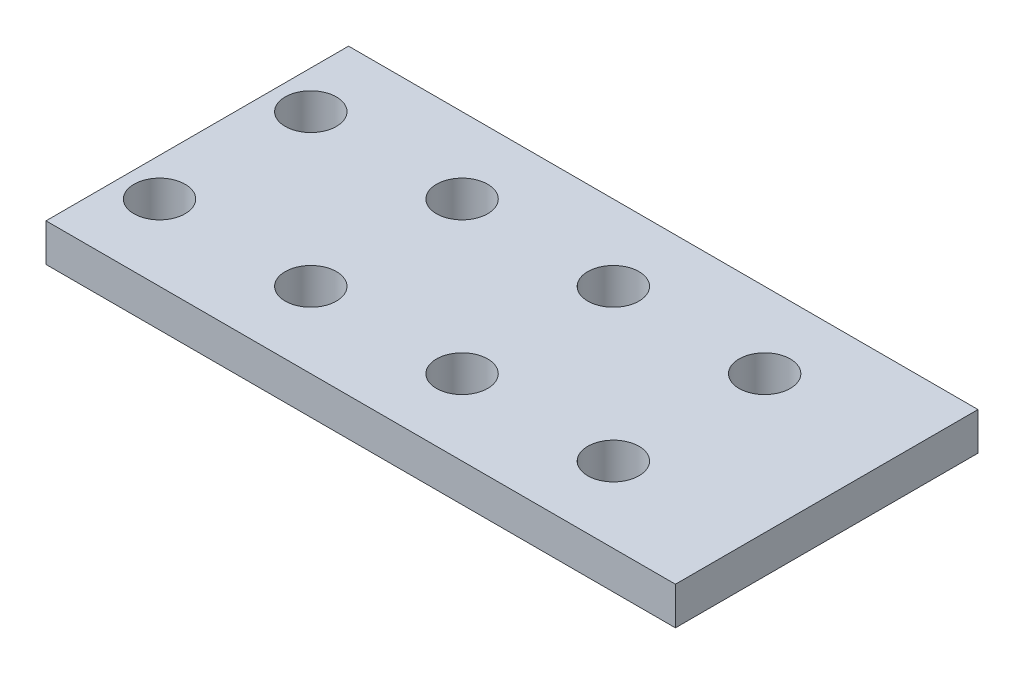
ISO-10303-21;
HEADER;
FILE_DESCRIPTION(('STEP AP214'),'2;1');
FILE_NAME('part.step','',(''),(''),'','','');
FILE_SCHEMA(('AUTOMOTIVE_DESIGN { 1 0 10303 214 1 1 1 1 }'));
ENDSEC;
DATA;
#1=APPLICATION_CONTEXT('core data for automotive mechanical design processes');
#2=APPLICATION_PROTOCOL_DEFINITION('international standard','automotive_design',2000,#1);
#3=PRODUCT_CONTEXT('',#1,'mechanical');
#4=PRODUCT('Part','Part','',(#3));
#5=PRODUCT_RELATED_PRODUCT_CATEGORY('part','',(#4));
#6=PRODUCT_DEFINITION_FORMATION('','',#4);
#7=PRODUCT_DEFINITION_CONTEXT('part definition',#1,'design');
#8=PRODUCT_DEFINITION('design','',#6,#7);
#9=PRODUCT_DEFINITION_SHAPE('','',#8);
#10=(LENGTH_UNIT() NAMED_UNIT(*) SI_UNIT(.MILLI.,.METRE.));
#11=(NAMED_UNIT(*) PLANE_ANGLE_UNIT() SI_UNIT($,.RADIAN.));
#12=(NAMED_UNIT(*) SI_UNIT($,.STERADIAN.) SOLID_ANGLE_UNIT());
#13=UNCERTAINTY_MEASURE_WITH_UNIT(LENGTH_MEASURE(1.E-05),#10,'distance_accuracy_value','');
#14=(GEOMETRIC_REPRESENTATION_CONTEXT(3) GLOBAL_UNCERTAINTY_ASSIGNED_CONTEXT((#13)) GLOBAL_UNIT_ASSIGNED_CONTEXT((#10,
#11,#12)) REPRESENTATION_CONTEXT('',''));
#15=CARTESIAN_POINT('',(0.,0.,0.));
#16=DIRECTION('',(0.,0.,1.));
#17=DIRECTION('',(1.,0.,0.));
#18=AXIS2_PLACEMENT_3D('',#15,#16,#17);
#19=CARTESIAN_POINT('',(20.,3.175,0.));
#20=DIRECTION('',(1.,0.,0.));
#21=DIRECTION('',(0.,0.,-1.));
#22=AXIS2_PLACEMENT_3D('',#19,#20,#21);
#23=PLANE('',#22);
#24=DIRECTION('',(0.,0.,1.));
#25=VECTOR('',#24,1.);
#26=CARTESIAN_POINT('',(20.,0.,0.));
#27=LINE('',#26,#25);
#28=CARTESIAN_POINT('',(20.,0.,-12.7));
#29=VERTEX_POINT('',#28);
#30=CARTESIAN_POINT('',(20.,0.,12.7));
#31=VERTEX_POINT('',#30);
#32=EDGE_CURVE('E146',#29,#31,#27,.T.);
#33=ORIENTED_EDGE('',*,*,#32,.T.);
#34=DIRECTION('',(0.,-1.,0.));
#35=VECTOR('',#34,1.);
#36=CARTESIAN_POINT('',(20.,3.175,12.7));
#37=LINE('',#36,#35);
#38=CARTESIAN_POINT('',(20.,3.175,12.7));
#39=VERTEX_POINT('',#38);
#40=EDGE_CURVE('E11',#39,#31,#37,.T.);
#41=ORIENTED_EDGE('',*,*,#40,.F.);
#42=DIRECTION('',(0.,0.,1.));
#43=VECTOR('',#42,1.);
#44=CARTESIAN_POINT('',(20.,3.175,0.));
#45=LINE('',#44,#43);
#46=CARTESIAN_POINT('',(20.,3.175,-12.7));
#47=VERTEX_POINT('',#46);
#48=EDGE_CURVE('E96',#47,#39,#45,.T.);
#49=ORIENTED_EDGE('',*,*,#48,.F.);
#50=DIRECTION('',(0.,-1.,0.));
#51=VECTOR('',#50,1.);
#52=CARTESIAN_POINT('',(20.,3.175,-12.7));
#53=LINE('',#52,#51);
#54=EDGE_CURVE('E63',#47,#29,#53,.T.);
#55=ORIENTED_EDGE('',*,*,#54,.T.);
#56=EDGE_LOOP('',(#33,#41,#49,#55));
#57=FACE_BOUND('',#56,.T.);
#58=ADVANCED_FACE('F45',(#57),#23,.F.);
#59=CARTESIAN_POINT('',(0.,3.175,12.7));
#60=DIRECTION('',(0.,0.,-1.));
#61=DIRECTION('',(-1.,0.,0.));
#62=AXIS2_PLACEMENT_3D('',#59,#60,#61);
#63=PLANE('',#62);
#64=DIRECTION('',(1.,0.,0.));
#65=VECTOR('',#64,1.);
#66=CARTESIAN_POINT('',(0.,0.,12.7));
#67=LINE('',#66,#65);
#68=CARTESIAN_POINT('',(72.84,0.,12.7));
#69=VERTEX_POINT('',#68);
#70=EDGE_CURVE('E102',#31,#69,#67,.T.);
#71=ORIENTED_EDGE('',*,*,#70,.T.);
#72=DIRECTION('',(0.,-1.,0.));
#73=VECTOR('',#72,1.);
#74=CARTESIAN_POINT('',(72.84,3.175,12.7));
#75=LINE('',#74,#73);
#76=CARTESIAN_POINT('',(72.84,3.175,12.7));
#77=VERTEX_POINT('',#76);
#78=EDGE_CURVE('E55',#77,#69,#75,.T.);
#79=ORIENTED_EDGE('',*,*,#78,.F.);
#80=DIRECTION('',(1.,0.,0.));
#81=VECTOR('',#80,1.);
#82=CARTESIAN_POINT('',(0.,3.175,12.7));
#83=LINE('',#82,#81);
#84=EDGE_CURVE('E88',#39,#77,#83,.T.);
#85=ORIENTED_EDGE('',*,*,#84,.F.);
#86=ORIENTED_EDGE('',*,*,#40,.T.);
#87=EDGE_LOOP('',(#71,#79,#85,#86));
#88=FACE_BOUND('',#87,.T.);
#89=ADVANCED_FACE('F101',(#88),#63,.F.);
#90=CARTESIAN_POINT('',(72.84,3.175,0.));
#91=DIRECTION('',(1.,0.,0.));
#92=DIRECTION('',(0.,0.,-1.));
#93=AXIS2_PLACEMENT_3D('',#90,#91,#92);
#94=PLANE('',#93);
#95=DIRECTION('',(0.,0.,1.));
#96=VECTOR('',#95,1.);
#97=CARTESIAN_POINT('',(72.84,0.,0.));
#98=LINE('',#97,#96);
#99=CARTESIAN_POINT('',(72.84,0.,-12.7));
#100=VERTEX_POINT('',#99);
#101=EDGE_CURVE('E151',#100,#69,#98,.T.);
#102=ORIENTED_EDGE('',*,*,#101,.F.);
#103=DIRECTION('',(0.,-1.,0.));
#104=VECTOR('',#103,1.);
#105=CARTESIAN_POINT('',(72.84,3.175,-12.7));
#106=LINE('',#105,#104);
#107=CARTESIAN_POINT('',(72.84,3.175,-12.7));
#108=VERTEX_POINT('',#107);
#109=EDGE_CURVE('E77',#108,#100,#106,.T.);
#110=ORIENTED_EDGE('',*,*,#109,.F.);
#111=DIRECTION('',(0.,0.,1.));
#112=VECTOR('',#111,1.);
#113=CARTESIAN_POINT('',(72.84,3.175,0.));
#114=LINE('',#113,#112);
#115=EDGE_CURVE('E95',#108,#77,#114,.T.);
#116=ORIENTED_EDGE('',*,*,#115,.T.);
#117=ORIENTED_EDGE('',*,*,#78,.T.);
#118=EDGE_LOOP('',(#102,#110,#116,#117));
#119=FACE_BOUND('',#118,.T.);
#120=ADVANCED_FACE('F106',(#119),#94,.T.);
#121=CARTESIAN_POINT('',(23.18,3.175,-6.35));
#122=DIRECTION('',(0.,-1.,0.));
#123=DIRECTION('',(0.,0.,-1.));
#124=AXIS2_PLACEMENT_3D('',#121,#122,#123);
#125=CYLINDRICAL_SURFACE('',#124,2.15);
#126=CARTESIAN_POINT('',(23.18,3.175,-6.35));
#127=DIRECTION('',(0.,1.,0.));
#128=DIRECTION('',(0.,0.,1.));
#129=AXIS2_PLACEMENT_3D('',#126,#127,#128);
#130=CIRCLE('',#129,2.15);
#131=CARTESIAN_POINT('',(23.18,3.175,-4.2));
#132=VERTEX_POINT('',#131);
#133=EDGE_CURVE('E193',#132,#132,#130,.T.);
#134=ORIENTED_EDGE('',*,*,#133,.T.);
#135=EDGE_LOOP('',(#134));
#136=FACE_BOUND('',#135,.T.);
#137=CARTESIAN_POINT('',(23.18,0.,-6.35));
#138=DIRECTION('',(0.,1.,0.));
#139=DIRECTION('',(0.,0.,1.));
#140=AXIS2_PLACEMENT_3D('',#137,#138,#139);
#141=CIRCLE('',#140,2.15);
#142=CARTESIAN_POINT('',(23.18,0.,-4.2));
#143=VERTEX_POINT('',#142);
#144=EDGE_CURVE('E142',#143,#143,#141,.T.);
#145=ORIENTED_EDGE('',*,*,#144,.F.);
#146=EDGE_LOOP('',(#145));
#147=FACE_BOUND('',#146,.T.);
#148=ADVANCED_FACE('F199',(#136,#147),#125,.F.);
#149=CARTESIAN_POINT('',(35.88,3.175,-6.35));
#150=DIRECTION('',(0.,-1.,0.));
#151=DIRECTION('',(0.,0.,-1.));
#152=AXIS2_PLACEMENT_3D('',#149,#150,#151);
#153=CYLINDRICAL_SURFACE('',#152,2.15);
#154=CARTESIAN_POINT('',(35.88,3.175,-6.35));
#155=DIRECTION('',(0.,1.,0.));
#156=DIRECTION('',(0.,0.,1.));
#157=AXIS2_PLACEMENT_3D('',#154,#155,#156);
#158=CIRCLE('',#157,2.15);
#159=CARTESIAN_POINT('',(35.88,3.175,-4.2));
#160=VERTEX_POINT('',#159);
#161=EDGE_CURVE('E189',#160,#160,#158,.T.);
#162=ORIENTED_EDGE('',*,*,#161,.T.);
#163=EDGE_LOOP('',(#162));
#164=FACE_BOUND('',#163,.T.);
#165=CARTESIAN_POINT('',(35.88,0.,-6.35));
#166=DIRECTION('',(0.,1.,0.));
#167=DIRECTION('',(0.,0.,1.));
#168=AXIS2_PLACEMENT_3D('',#165,#166,#167);
#169=CIRCLE('',#168,2.15);
#170=CARTESIAN_POINT('',(35.88,0.,-4.2));
#171=VERTEX_POINT('',#170);
#172=EDGE_CURVE('E138',#171,#171,#169,.T.);
#173=ORIENTED_EDGE('',*,*,#172,.F.);
#174=EDGE_LOOP('',(#173));
#175=FACE_BOUND('',#174,.T.);
#176=ADVANCED_FACE('F225',(#164,#175),#153,.F.);
#177=CARTESIAN_POINT('',(48.58,3.175,-6.35));
#178=DIRECTION('',(0.,-1.,0.));
#179=DIRECTION('',(0.,0.,-1.));
#180=AXIS2_PLACEMENT_3D('',#177,#178,#179);
#181=CYLINDRICAL_SURFACE('',#180,2.15);
#182=CARTESIAN_POINT('',(48.58,3.175,-6.35));
#183=DIRECTION('',(0.,1.,0.));
#184=DIRECTION('',(0.,0.,1.));
#185=AXIS2_PLACEMENT_3D('',#182,#183,#184);
#186=CIRCLE('',#185,2.15);
#187=CARTESIAN_POINT('',(48.58,3.175,-4.2));
#188=VERTEX_POINT('',#187);
#189=EDGE_CURVE('E185',#188,#188,#186,.T.);
#190=ORIENTED_EDGE('',*,*,#189,.T.);
#191=EDGE_LOOP('',(#190));
#192=FACE_BOUND('',#191,.T.);
#193=CARTESIAN_POINT('',(48.58,0.,-6.35));
#194=DIRECTION('',(0.,1.,0.));
#195=DIRECTION('',(0.,0.,1.));
#196=AXIS2_PLACEMENT_3D('',#193,#194,#195);
#197=CIRCLE('',#196,2.15);
#198=CARTESIAN_POINT('',(48.58,0.,-4.2));
#199=VERTEX_POINT('',#198);
#200=EDGE_CURVE('E134',#199,#199,#197,.T.);
#201=ORIENTED_EDGE('',*,*,#200,.F.);
#202=EDGE_LOOP('',(#201));
#203=FACE_BOUND('',#202,.T.);
#204=ADVANCED_FACE('F228',(#192,#203),#181,.F.);
#205=CARTESIAN_POINT('',(35.88,3.175,6.35));
#206=DIRECTION('',(0.,-1.,0.));
#207=DIRECTION('',(0.,0.,-1.));
#208=AXIS2_PLACEMENT_3D('',#205,#206,#207);
#209=CYLINDRICAL_SURFACE('',#208,2.15);
#210=CARTESIAN_POINT('',(35.88,3.175,6.35));
#211=DIRECTION('',(0.,1.,0.));
#212=DIRECTION('',(0.,0.,1.));
#213=AXIS2_PLACEMENT_3D('',#210,#211,#212);
#214=CIRCLE('',#213,2.15);
#215=CARTESIAN_POINT('',(35.88,3.175,8.5));
#216=VERTEX_POINT('',#215);
#217=EDGE_CURVE('E181',#216,#216,#214,.T.);
#218=ORIENTED_EDGE('',*,*,#217,.T.);
#219=EDGE_LOOP('',(#218));
#220=FACE_BOUND('',#219,.T.);
#221=CARTESIAN_POINT('',(35.88,0.,6.35));
#222=DIRECTION('',(0.,1.,0.));
#223=DIRECTION('',(0.,0.,1.));
#224=AXIS2_PLACEMENT_3D('',#221,#222,#223);
#225=CIRCLE('',#224,2.15);
#226=CARTESIAN_POINT('',(35.88,0.,8.5));
#227=VERTEX_POINT('',#226);
#228=EDGE_CURVE('E130',#227,#227,#225,.T.);
#229=ORIENTED_EDGE('',*,*,#228,.F.);
#230=EDGE_LOOP('',(#229));
#231=FACE_BOUND('',#230,.T.);
#232=ADVANCED_FACE('F232',(#220,#231),#209,.F.);
#233=CARTESIAN_POINT('',(48.58,3.175,6.35));
#234=DIRECTION('',(0.,-1.,0.));
#235=DIRECTION('',(0.,0.,-1.));
#236=AXIS2_PLACEMENT_3D('',#233,#234,#235);
#237=CYLINDRICAL_SURFACE('',#236,2.15);
#238=CARTESIAN_POINT('',(48.58,3.175,6.35));
#239=DIRECTION('',(0.,1.,0.));
#240=DIRECTION('',(0.,0.,1.));
#241=AXIS2_PLACEMENT_3D('',#238,#239,#240);
#242=CIRCLE('',#241,2.15);
#243=CARTESIAN_POINT('',(48.58,3.175,8.5));
#244=VERTEX_POINT('',#243);
#245=EDGE_CURVE('E177',#244,#244,#242,.T.);
#246=ORIENTED_EDGE('',*,*,#245,.T.);
#247=EDGE_LOOP('',(#246));
#248=FACE_BOUND('',#247,.T.);
#249=CARTESIAN_POINT('',(48.58,0.,6.35));
#250=DIRECTION('',(0.,1.,0.));
#251=DIRECTION('',(0.,0.,1.));
#252=AXIS2_PLACEMENT_3D('',#249,#250,#251);
#253=CIRCLE('',#252,2.15);
#254=CARTESIAN_POINT('',(48.58,0.,8.5));
#255=VERTEX_POINT('',#254);
#256=EDGE_CURVE('E126',#255,#255,#253,.T.);
#257=ORIENTED_EDGE('',*,*,#256,.F.);
#258=EDGE_LOOP('',(#257));
#259=FACE_BOUND('',#258,.T.);
#260=ADVANCED_FACE('F236',(#248,#259),#237,.F.);
#261=CARTESIAN_POINT('',(23.18,3.175,6.35));
#262=DIRECTION('',(0.,-1.,0.));
#263=DIRECTION('',(0.,0.,-1.));
#264=AXIS2_PLACEMENT_3D('',#261,#262,#263);
#265=CYLINDRICAL_SURFACE('',#264,2.15);
#266=CARTESIAN_POINT('',(23.18,3.175,6.35));
#267=DIRECTION('',(0.,1.,0.));
#268=DIRECTION('',(0.,0.,1.));
#269=AXIS2_PLACEMENT_3D('',#266,#267,#268);
#270=CIRCLE('',#269,2.15);
#271=CARTESIAN_POINT('',(23.18,3.175,8.5));
#272=VERTEX_POINT('',#271);
#273=EDGE_CURVE('E171',#272,#272,#270,.T.);
#274=ORIENTED_EDGE('',*,*,#273,.T.);
#275=EDGE_LOOP('',(#274));
#276=FACE_BOUND('',#275,.T.);
#277=CARTESIAN_POINT('',(23.18,0.,6.35));
#278=DIRECTION('',(0.,1.,0.));
#279=DIRECTION('',(0.,0.,1.));
#280=AXIS2_PLACEMENT_3D('',#277,#278,#279);
#281=CIRCLE('',#280,2.15);
#282=CARTESIAN_POINT('',(23.18,0.,8.5));
#283=VERTEX_POINT('',#282);
#284=EDGE_CURVE('E122',#283,#283,#281,.T.);
#285=ORIENTED_EDGE('',*,*,#284,.F.);
#286=EDGE_LOOP('',(#285));
#287=FACE_BOUND('',#286,.T.);
#288=ADVANCED_FACE('F240',(#276,#287),#265,.F.);
#289=CARTESIAN_POINT('',(61.28,3.175,-6.35));
#290=DIRECTION('',(0.,-1.,0.));
#291=DIRECTION('',(0.,0.,-1.));
#292=AXIS2_PLACEMENT_3D('',#289,#290,#291);
#293=CYLINDRICAL_SURFACE('',#292,2.15);
#294=CARTESIAN_POINT('',(61.28,3.175,-6.35));
#295=DIRECTION('',(0.,1.,0.));
#296=DIRECTION('',(0.,0.,1.));
#297=AXIS2_PLACEMENT_3D('',#294,#295,#296);
#298=CIRCLE('',#297,2.15);
#299=CARTESIAN_POINT('',(61.28,3.175,-4.2));
#300=VERTEX_POINT('',#299);
#301=EDGE_CURVE('E165',#300,#300,#298,.T.);
#302=ORIENTED_EDGE('',*,*,#301,.T.);
#303=EDGE_LOOP('',(#302));
#304=FACE_BOUND('',#303,.T.);
#305=CARTESIAN_POINT('',(61.28,0.,-6.35));
#306=DIRECTION('',(0.,1.,0.));
#307=DIRECTION('',(0.,0.,1.));
#308=AXIS2_PLACEMENT_3D('',#305,#306,#307);
#309=CIRCLE('',#308,2.15);
#310=CARTESIAN_POINT('',(61.28,0.,-4.2));
#311=VERTEX_POINT('',#310);
#312=EDGE_CURVE('E118',#311,#311,#309,.T.);
#313=ORIENTED_EDGE('',*,*,#312,.F.);
#314=EDGE_LOOP('',(#313));
#315=FACE_BOUND('',#314,.T.);
#316=ADVANCED_FACE('F243',(#304,#315),#293,.F.);
#317=CARTESIAN_POINT('',(61.28,3.175,6.35));
#318=DIRECTION('',(0.,-1.,0.));
#319=DIRECTION('',(0.,0.,-1.));
#320=AXIS2_PLACEMENT_3D('',#317,#318,#319);
#321=CYLINDRICAL_SURFACE('',#320,2.15);
#322=CARTESIAN_POINT('',(61.28,3.175,6.35));
#323=DIRECTION('',(0.,1.,0.));
#324=DIRECTION('',(0.,0.,1.));
#325=AXIS2_PLACEMENT_3D('',#322,#323,#324);
#326=CIRCLE('',#325,2.15);
#327=CARTESIAN_POINT('',(61.28,3.175,8.5));
#328=VERTEX_POINT('',#327);
#329=EDGE_CURVE('E158',#328,#328,#326,.T.);
#330=ORIENTED_EDGE('',*,*,#329,.T.);
#331=EDGE_LOOP('',(#330));
#332=FACE_BOUND('',#331,.T.);
#333=CARTESIAN_POINT('',(61.28,0.,6.35));
#334=DIRECTION('',(0.,1.,0.));
#335=DIRECTION('',(0.,0.,1.));
#336=AXIS2_PLACEMENT_3D('',#333,#334,#335);
#337=CIRCLE('',#336,2.15);
#338=CARTESIAN_POINT('',(61.28,0.,8.5));
#339=VERTEX_POINT('',#338);
#340=EDGE_CURVE('E114',#339,#339,#337,.T.);
#341=ORIENTED_EDGE('',*,*,#340,.F.);
#342=EDGE_LOOP('',(#341));
#343=FACE_BOUND('',#342,.T.);
#344=ADVANCED_FACE('F47',(#332,#343),#321,.F.);
#345=CARTESIAN_POINT('',(0.,3.175,-12.7));
#346=DIRECTION('',(0.,0.,-1.));
#347=DIRECTION('',(-1.,0.,0.));
#348=AXIS2_PLACEMENT_3D('',#345,#346,#347);
#349=PLANE('',#348);
#350=DIRECTION('',(1.,0.,0.));
#351=VECTOR('',#350,1.);
#352=CARTESIAN_POINT('',(0.,0.,-12.7));
#353=LINE('',#352,#351);
#354=EDGE_CURVE('E154',#29,#100,#353,.T.);
#355=ORIENTED_EDGE('',*,*,#354,.F.);
#356=ORIENTED_EDGE('',*,*,#54,.F.);
#357=DIRECTION('',(1.,0.,0.));
#358=VECTOR('',#357,1.);
#359=CARTESIAN_POINT('',(0.,3.175,-12.7));
#360=LINE('',#359,#358);
#361=EDGE_CURVE('E108',#47,#108,#360,.T.);
#362=ORIENTED_EDGE('',*,*,#361,.T.);
#363=ORIENTED_EDGE('',*,*,#109,.T.);
#364=EDGE_LOOP('',(#355,#356,#362,#363));
#365=FACE_BOUND('',#364,.T.);
#366=ADVANCED_FACE('F204',(#365),#349,.T.);
#367=CARTESIAN_POINT('',(0.,3.175,0.));
#368=DIRECTION('',(0.,1.,0.));
#369=DIRECTION('',(0.,0.,1.));
#370=AXIS2_PLACEMENT_3D('',#367,#368,#369);
#371=PLANE('',#370);
#372=ORIENTED_EDGE('',*,*,#329,.F.);
#373=EDGE_LOOP('',(#372));
#374=FACE_BOUND('',#373,.T.);
#375=ORIENTED_EDGE('',*,*,#301,.F.);
#376=EDGE_LOOP('',(#375));
#377=FACE_BOUND('',#376,.T.);
#378=ORIENTED_EDGE('',*,*,#273,.F.);
#379=EDGE_LOOP('',(#378));
#380=FACE_BOUND('',#379,.T.);
#381=ORIENTED_EDGE('',*,*,#245,.F.);
#382=EDGE_LOOP('',(#381));
#383=FACE_BOUND('',#382,.T.);
#384=ORIENTED_EDGE('',*,*,#217,.F.);
#385=EDGE_LOOP('',(#384));
#386=FACE_BOUND('',#385,.T.);
#387=ORIENTED_EDGE('',*,*,#189,.F.);
#388=EDGE_LOOP('',(#387));
#389=FACE_BOUND('',#388,.T.);
#390=ORIENTED_EDGE('',*,*,#161,.F.);
#391=EDGE_LOOP('',(#390));
#392=FACE_BOUND('',#391,.T.);
#393=ORIENTED_EDGE('',*,*,#133,.F.);
#394=EDGE_LOOP('',(#393));
#395=FACE_BOUND('',#394,.T.);
#396=ORIENTED_EDGE('',*,*,#48,.T.);
#397=ORIENTED_EDGE('',*,*,#84,.T.);
#398=ORIENTED_EDGE('',*,*,#115,.F.);
#399=ORIENTED_EDGE('',*,*,#361,.F.);
#400=EDGE_LOOP('',(#396,#397,#398,#399));
#401=FACE_BOUND('',#400,.T.);
#402=ADVANCED_FACE('F92',(#374,#377,#380,#383,#386,#389,#392,#395,#401),#371,.T.);
#403=CARTESIAN_POINT('',(0.,0.,0.));
#404=DIRECTION('',(0.,1.,0.));
#405=DIRECTION('',(0.,0.,1.));
#406=AXIS2_PLACEMENT_3D('',#403,#404,#405);
#407=PLANE('',#406);
#408=ORIENTED_EDGE('',*,*,#340,.T.);
#409=EDGE_LOOP('',(#408));
#410=FACE_BOUND('',#409,.T.);
#411=ORIENTED_EDGE('',*,*,#312,.T.);
#412=EDGE_LOOP('',(#411));
#413=FACE_BOUND('',#412,.T.);
#414=ORIENTED_EDGE('',*,*,#284,.T.);
#415=EDGE_LOOP('',(#414));
#416=FACE_BOUND('',#415,.T.);
#417=ORIENTED_EDGE('',*,*,#256,.T.);
#418=EDGE_LOOP('',(#417));
#419=FACE_BOUND('',#418,.T.);
#420=ORIENTED_EDGE('',*,*,#228,.T.);
#421=EDGE_LOOP('',(#420));
#422=FACE_BOUND('',#421,.T.);
#423=ORIENTED_EDGE('',*,*,#200,.T.);
#424=EDGE_LOOP('',(#423));
#425=FACE_BOUND('',#424,.T.);
#426=ORIENTED_EDGE('',*,*,#172,.T.);
#427=EDGE_LOOP('',(#426));
#428=FACE_BOUND('',#427,.T.);
#429=ORIENTED_EDGE('',*,*,#144,.T.);
#430=EDGE_LOOP('',(#429));
#431=FACE_BOUND('',#430,.T.);
#432=ORIENTED_EDGE('',*,*,#32,.F.);
#433=ORIENTED_EDGE('',*,*,#354,.T.);
#434=ORIENTED_EDGE('',*,*,#101,.T.);
#435=ORIENTED_EDGE('',*,*,#70,.F.);
#436=EDGE_LOOP('',(#432,#433,#434,#435));
#437=FACE_BOUND('',#436,.T.);
#438=ADVANCED_FACE('F203',(#410,#413,#416,#419,#422,#425,#428,#431,#437),#407,.F.);
#439=CLOSED_SHELL('',(#58,#89,#120,#148,#176,#204,#232,#260,#288,#316,#344,#366,#402,#438));
#440=MANIFOLD_SOLID_BREP('B2',#439);
#441=ADVANCED_BREP_SHAPE_REPRESENTATION('',(#18,#440),#14);
#442=SHAPE_DEFINITION_REPRESENTATION(#9,#441);
ENDSEC;
END-ISO-10303-21;
